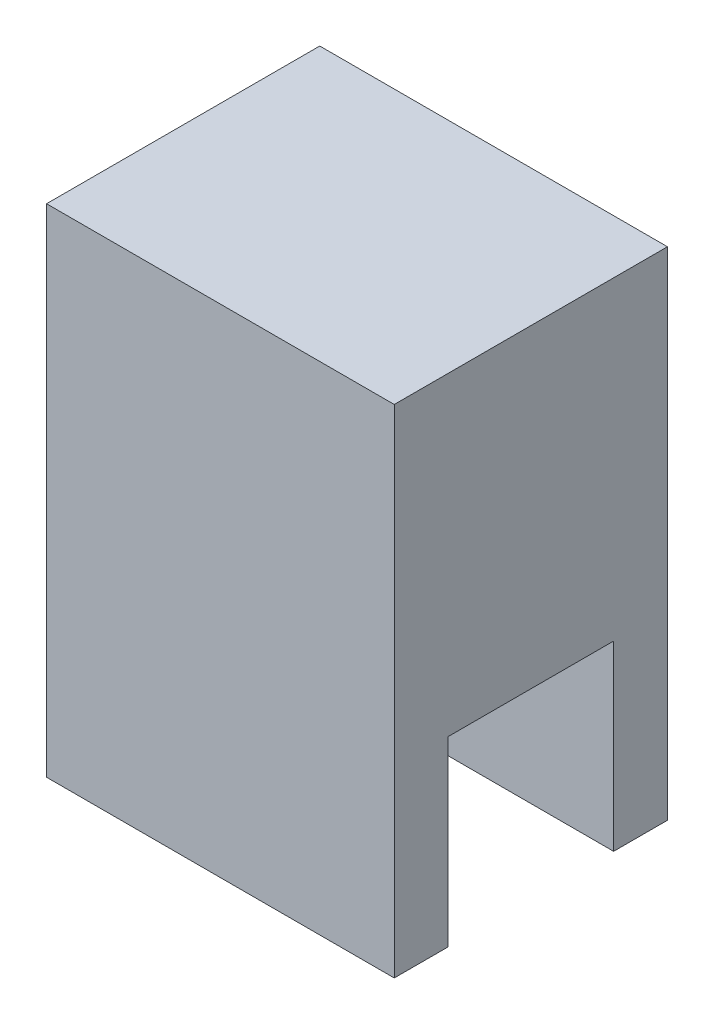
ISO-10303-21;
HEADER;
FILE_DESCRIPTION(('STEP AP214'),'2;1');
FILE_NAME('part.step','',(''),(''),'','','');
FILE_SCHEMA(('AUTOMOTIVE_DESIGN { 1 0 10303 214 1 1 1 1 }'));
ENDSEC;
DATA;
#1=APPLICATION_CONTEXT('core data for automotive mechanical design processes');
#2=APPLICATION_PROTOCOL_DEFINITION('international standard','automotive_design',2000,#1);
#3=PRODUCT_CONTEXT('',#1,'mechanical');
#4=PRODUCT('Part','Part','',(#3));
#5=PRODUCT_RELATED_PRODUCT_CATEGORY('part','',(#4));
#6=PRODUCT_DEFINITION_FORMATION('','',#4);
#7=PRODUCT_DEFINITION_CONTEXT('part definition',#1,'design');
#8=PRODUCT_DEFINITION('design','',#6,#7);
#9=PRODUCT_DEFINITION_SHAPE('','',#8);
#10=(LENGTH_UNIT() NAMED_UNIT(*) SI_UNIT(.MILLI.,.METRE.));
#11=(NAMED_UNIT(*) PLANE_ANGLE_UNIT() SI_UNIT($,.RADIAN.));
#12=(NAMED_UNIT(*) SI_UNIT($,.STERADIAN.) SOLID_ANGLE_UNIT());
#13=UNCERTAINTY_MEASURE_WITH_UNIT(LENGTH_MEASURE(1.E-05),#10,'distance_accuracy_value','');
#14=(GEOMETRIC_REPRESENTATION_CONTEXT(3) GLOBAL_UNCERTAINTY_ASSIGNED_CONTEXT((#13)) GLOBAL_UNIT_ASSIGNED_CONTEXT((#10,
#11,#12)) REPRESENTATION_CONTEXT('',''));
#15=CARTESIAN_POINT('',(0.,0.,0.));
#16=DIRECTION('',(0.,0.,1.));
#17=DIRECTION('',(1.,0.,0.));
#18=AXIS2_PLACEMENT_3D('',#15,#16,#17);
#19=CARTESIAN_POINT('',(0.,-30.,0.));
#20=DIRECTION('',(0.,1.,0.));
#21=DIRECTION('',(0.,0.,1.));
#22=AXIS2_PLACEMENT_3D('',#19,#20,#21);
#23=PLANE('',#22);
#24=DIRECTION('',(0.,0.,1.));
#25=VECTOR('',#24,1.);
#26=CARTESIAN_POINT('',(-21.,-30.,-16.5));
#27=LINE('',#26,#25);
#28=CARTESIAN_POINT('',(-21.,-30.,10.));
#29=VERTEX_POINT('',#28);
#30=CARTESIAN_POINT('',(-21.,-30.,16.5));
#31=VERTEX_POINT('',#30);
#32=EDGE_CURVE('E127',#29,#31,#27,.T.);
#33=ORIENTED_EDGE('',*,*,#32,.F.);
#34=DIRECTION('',(1.,0.,0.));
#35=VECTOR('',#34,1.);
#36=CARTESIAN_POINT('',(-21.,-30.,10.));
#37=LINE('',#36,#35);
#38=CARTESIAN_POINT('',(21.,-30.,10.));
#39=VERTEX_POINT('',#38);
#40=EDGE_CURVE('E114',#29,#39,#37,.T.);
#41=ORIENTED_EDGE('',*,*,#40,.T.);
#42=DIRECTION('',(0.,0.,-1.));
#43=VECTOR('',#42,1.);
#44=CARTESIAN_POINT('',(21.,-30.,-16.5));
#45=LINE('',#44,#43);
#46=CARTESIAN_POINT('',(21.,-30.,16.5));
#47=VERTEX_POINT('',#46);
#48=EDGE_CURVE('E126',#47,#39,#45,.T.);
#49=ORIENTED_EDGE('',*,*,#48,.F.);
#50=DIRECTION('',(1.,0.,0.));
#51=VECTOR('',#50,1.);
#52=CARTESIAN_POINT('',(-21.,-30.,16.5));
#53=LINE('',#52,#51);
#54=EDGE_CURVE('E82',#31,#47,#53,.T.);
#55=ORIENTED_EDGE('',*,*,#54,.F.);
#56=EDGE_LOOP('',(#33,#41,#49,#55));
#57=FACE_BOUND('',#56,.T.);
#58=ADVANCED_FACE('F37',(#57),#23,.F.);
#59=CARTESIAN_POINT('',(21.,30.,-16.5));
#60=DIRECTION('',(-1.,0.,0.));
#61=DIRECTION('',(0.,0.,1.));
#62=AXIS2_PLACEMENT_3D('',#59,#60,#61);
#63=PLANE('',#62);
#64=ORIENTED_EDGE('',*,*,#48,.T.);
#65=DIRECTION('',(0.,-1.,0.));
#66=VECTOR('',#65,1.);
#67=CARTESIAN_POINT('',(21.,-30.,10.));
#68=LINE('',#67,#66);
#69=CARTESIAN_POINT('',(21.,-8.,10.));
#70=VERTEX_POINT('',#69);
#71=EDGE_CURVE('E110',#70,#39,#68,.T.);
#72=ORIENTED_EDGE('',*,*,#71,.F.);
#73=DIRECTION('',(0.,0.,1.));
#74=VECTOR('',#73,1.);
#75=CARTESIAN_POINT('',(21.,-8.,10.));
#76=LINE('',#75,#74);
#77=CARTESIAN_POINT('',(21.,-8.,-10.));
#78=VERTEX_POINT('',#77);
#79=EDGE_CURVE('E202',#78,#70,#76,.T.);
#80=ORIENTED_EDGE('',*,*,#79,.F.);
#81=DIRECTION('',(0.,1.,0.));
#82=VECTOR('',#81,1.);
#83=CARTESIAN_POINT('',(21.,-30.,-10.));
#84=LINE('',#83,#82);
#85=CARTESIAN_POINT('',(21.,-30.,-10.));
#86=VERTEX_POINT('',#85);
#87=EDGE_CURVE('E121',#86,#78,#84,.T.);
#88=ORIENTED_EDGE('',*,*,#87,.F.);
#89=CARTESIAN_POINT('',(21.,-30.,-16.5));
#90=VERTEX_POINT('',#89);
#91=EDGE_CURVE('E134',#86,#90,#45,.T.);
#92=ORIENTED_EDGE('',*,*,#91,.T.);
#93=DIRECTION('',(0.,-1.,0.));
#94=VECTOR('',#93,1.);
#95=CARTESIAN_POINT('',(21.,30.,-16.5));
#96=LINE('',#95,#94);
#97=CARTESIAN_POINT('',(21.,30.,-16.5));
#98=VERTEX_POINT('',#97);
#99=EDGE_CURVE('E11',#98,#90,#96,.T.);
#100=ORIENTED_EDGE('',*,*,#99,.F.);
#101=DIRECTION('',(0.,0.,-1.));
#102=VECTOR('',#101,1.);
#103=CARTESIAN_POINT('',(21.,30.,-16.5));
#104=LINE('',#103,#102);
#105=CARTESIAN_POINT('',(21.,30.,16.5));
#106=VERTEX_POINT('',#105);
#107=EDGE_CURVE('E144',#106,#98,#104,.T.);
#108=ORIENTED_EDGE('',*,*,#107,.F.);
#109=DIRECTION('',(0.,-1.,0.));
#110=VECTOR('',#109,1.);
#111=CARTESIAN_POINT('',(21.,30.,16.5));
#112=LINE('',#111,#110);
#113=EDGE_CURVE('E132',#106,#47,#112,.T.);
#114=ORIENTED_EDGE('',*,*,#113,.T.);
#115=EDGE_LOOP('',(#64,#72,#80,#88,#92,#100,#108,#114));
#116=FACE_BOUND('',#115,.T.);
#117=ADVANCED_FACE('F39',(#116),#63,.F.);
#118=CARTESIAN_POINT('',(-21.,30.,-16.5));
#119=DIRECTION('',(0.,0.,1.));
#120=DIRECTION('',(1.,0.,0.));
#121=AXIS2_PLACEMENT_3D('',#118,#119,#120);
#122=PLANE('',#121);
#123=DIRECTION('',(-1.,0.,0.));
#124=VECTOR('',#123,1.);
#125=CARTESIAN_POINT('',(-21.,-30.,-16.5));
#126=LINE('',#125,#124);
#127=CARTESIAN_POINT('',(-21.,-30.,-16.5));
#128=VERTEX_POINT('',#127);
#129=EDGE_CURVE('E133',#90,#128,#126,.T.);
#130=ORIENTED_EDGE('',*,*,#129,.T.);
#131=DIRECTION('',(0.,-1.,0.));
#132=VECTOR('',#131,1.);
#133=CARTESIAN_POINT('',(-21.,30.,-16.5));
#134=LINE('',#133,#132);
#135=CARTESIAN_POINT('',(-21.,30.,-16.5));
#136=VERTEX_POINT('',#135);
#137=EDGE_CURVE('E45',#136,#128,#134,.T.);
#138=ORIENTED_EDGE('',*,*,#137,.F.);
#139=DIRECTION('',(-1.,0.,0.));
#140=VECTOR('',#139,1.);
#141=CARTESIAN_POINT('',(-21.,30.,-16.5));
#142=LINE('',#141,#140);
#143=EDGE_CURVE('E89',#98,#136,#142,.T.);
#144=ORIENTED_EDGE('',*,*,#143,.F.);
#145=ORIENTED_EDGE('',*,*,#99,.T.);
#146=EDGE_LOOP('',(#130,#138,#144,#145));
#147=FACE_BOUND('',#146,.T.);
#148=ADVANCED_FACE('F170',(#147),#122,.F.);
#149=CARTESIAN_POINT('',(-21.,30.,-16.5));
#150=DIRECTION('',(1.,0.,0.));
#151=DIRECTION('',(0.,0.,-1.));
#152=AXIS2_PLACEMENT_3D('',#149,#150,#151);
#153=PLANE('',#152);
#154=DIRECTION('',(0.,0.,1.));
#155=VECTOR('',#154,1.);
#156=CARTESIAN_POINT('',(-21.,-8.,10.));
#157=LINE('',#156,#155);
#158=CARTESIAN_POINT('',(-21.,-8.,-10.));
#159=VERTEX_POINT('',#158);
#160=CARTESIAN_POINT('',(-21.,-8.,10.));
#161=VERTEX_POINT('',#160);
#162=EDGE_CURVE('E129',#159,#161,#157,.T.);
#163=ORIENTED_EDGE('',*,*,#162,.T.);
#164=DIRECTION('',(0.,-1.,0.));
#165=VECTOR('',#164,1.);
#166=CARTESIAN_POINT('',(-21.,-30.,10.));
#167=LINE('',#166,#165);
#168=EDGE_CURVE('E203',#161,#29,#167,.T.);
#169=ORIENTED_EDGE('',*,*,#168,.T.);
#170=ORIENTED_EDGE('',*,*,#32,.T.);
#171=DIRECTION('',(0.,-1.,0.));
#172=VECTOR('',#171,1.);
#173=CARTESIAN_POINT('',(-21.,30.,16.5));
#174=LINE('',#173,#172);
#175=CARTESIAN_POINT('',(-21.,30.,16.5));
#176=VERTEX_POINT('',#175);
#177=EDGE_CURVE('E146',#176,#31,#174,.T.);
#178=ORIENTED_EDGE('',*,*,#177,.F.);
#179=DIRECTION('',(0.,0.,1.));
#180=VECTOR('',#179,1.);
#181=CARTESIAN_POINT('',(-21.,30.,-16.5));
#182=LINE('',#181,#180);
#183=EDGE_CURVE('E154',#136,#176,#182,.T.);
#184=ORIENTED_EDGE('',*,*,#183,.F.);
#185=ORIENTED_EDGE('',*,*,#137,.T.);
#186=CARTESIAN_POINT('',(-21.,-30.,-10.));
#187=VERTEX_POINT('',#186);
#188=EDGE_CURVE('E140',#128,#187,#27,.T.);
#189=ORIENTED_EDGE('',*,*,#188,.T.);
#190=DIRECTION('',(0.,1.,0.));
#191=VECTOR('',#190,1.);
#192=CARTESIAN_POINT('',(-21.,-30.,-10.));
#193=LINE('',#192,#191);
#194=EDGE_CURVE('E52',#187,#159,#193,.T.);
#195=ORIENTED_EDGE('',*,*,#194,.T.);
#196=EDGE_LOOP('',(#163,#169,#170,#178,#184,#185,#189,#195));
#197=FACE_BOUND('',#196,.T.);
#198=ADVANCED_FACE('F152',(#197),#153,.F.);
#199=CARTESIAN_POINT('',(-21.,30.,16.5));
#200=DIRECTION('',(0.,0.,-1.));
#201=DIRECTION('',(-1.,0.,0.));
#202=AXIS2_PLACEMENT_3D('',#199,#200,#201);
#203=PLANE('',#202);
#204=ORIENTED_EDGE('',*,*,#54,.T.);
#205=ORIENTED_EDGE('',*,*,#113,.F.);
#206=DIRECTION('',(1.,0.,0.));
#207=VECTOR('',#206,1.);
#208=CARTESIAN_POINT('',(-21.,30.,16.5));
#209=LINE('',#208,#207);
#210=EDGE_CURVE('E61',#176,#106,#209,.T.);
#211=ORIENTED_EDGE('',*,*,#210,.F.);
#212=ORIENTED_EDGE('',*,*,#177,.T.);
#213=EDGE_LOOP('',(#204,#205,#211,#212));
#214=FACE_BOUND('',#213,.T.);
#215=ADVANCED_FACE('F168',(#214),#203,.F.);
#216=CARTESIAN_POINT('',(0.,30.,0.));
#217=DIRECTION('',(0.,1.,0.));
#218=DIRECTION('',(0.,0.,1.));
#219=AXIS2_PLACEMENT_3D('',#216,#217,#218);
#220=PLANE('',#219);
#221=ORIENTED_EDGE('',*,*,#107,.T.);
#222=ORIENTED_EDGE('',*,*,#143,.T.);
#223=ORIENTED_EDGE('',*,*,#183,.T.);
#224=ORIENTED_EDGE('',*,*,#210,.T.);
#225=EDGE_LOOP('',(#221,#222,#223,#224));
#226=FACE_BOUND('',#225,.T.);
#227=ADVANCED_FACE('F167',(#226),#220,.T.);
#228=ORIENTED_EDGE('',*,*,#91,.F.);
#229=DIRECTION('',(1.,0.,0.));
#230=VECTOR('',#229,1.);
#231=CARTESIAN_POINT('',(-21.,-30.,-10.));
#232=LINE('',#231,#230);
#233=EDGE_CURVE('E128',#187,#86,#232,.T.);
#234=ORIENTED_EDGE('',*,*,#233,.F.);
#235=ORIENTED_EDGE('',*,*,#188,.F.);
#236=ORIENTED_EDGE('',*,*,#129,.F.);
#237=EDGE_LOOP('',(#228,#234,#235,#236));
#238=FACE_BOUND('',#237,.T.);
#239=ADVANCED_FACE('F158',(#238),#23,.F.);
#240=CARTESIAN_POINT('',(-21.,-30.,10.));
#241=DIRECTION('',(0.,0.,1.));
#242=DIRECTION('',(1.,0.,0.));
#243=AXIS2_PLACEMENT_3D('',#240,#241,#242);
#244=PLANE('',#243);
#245=ORIENTED_EDGE('',*,*,#40,.F.);
#246=ORIENTED_EDGE('',*,*,#168,.F.);
#247=DIRECTION('',(1.,0.,0.));
#248=VECTOR('',#247,1.);
#249=CARTESIAN_POINT('',(-21.,-8.,10.));
#250=LINE('',#249,#248);
#251=EDGE_CURVE('E116',#161,#70,#250,.T.);
#252=ORIENTED_EDGE('',*,*,#251,.T.);
#253=ORIENTED_EDGE('',*,*,#71,.T.);
#254=EDGE_LOOP('',(#245,#246,#252,#253));
#255=FACE_BOUND('',#254,.T.);
#256=ADVANCED_FACE('F112',(#255),#244,.F.);
#257=CARTESIAN_POINT('',(-21.,-8.,10.));
#258=DIRECTION('',(0.,1.,0.));
#259=DIRECTION('',(0.,0.,1.));
#260=AXIS2_PLACEMENT_3D('',#257,#258,#259);
#261=PLANE('',#260);
#262=ORIENTED_EDGE('',*,*,#251,.F.);
#263=ORIENTED_EDGE('',*,*,#162,.F.);
#264=DIRECTION('',(1.,0.,0.));
#265=VECTOR('',#264,1.);
#266=CARTESIAN_POINT('',(-21.,-8.,-10.));
#267=LINE('',#266,#265);
#268=EDGE_CURVE('E161',#159,#78,#267,.T.);
#269=ORIENTED_EDGE('',*,*,#268,.T.);
#270=ORIENTED_EDGE('',*,*,#79,.T.);
#271=EDGE_LOOP('',(#262,#263,#269,#270));
#272=FACE_BOUND('',#271,.T.);
#273=ADVANCED_FACE('F188',(#272),#261,.F.);
#274=CARTESIAN_POINT('',(-21.,-30.,-10.));
#275=DIRECTION('',(0.,0.,-1.));
#276=DIRECTION('',(-1.,0.,0.));
#277=AXIS2_PLACEMENT_3D('',#274,#275,#276);
#278=PLANE('',#277);
#279=ORIENTED_EDGE('',*,*,#268,.F.);
#280=ORIENTED_EDGE('',*,*,#194,.F.);
#281=ORIENTED_EDGE('',*,*,#233,.T.);
#282=ORIENTED_EDGE('',*,*,#87,.T.);
#283=EDGE_LOOP('',(#279,#280,#281,#282));
#284=FACE_BOUND('',#283,.T.);
#285=ADVANCED_FACE('F194',(#284),#278,.F.);
#286=CLOSED_SHELL('',(#58,#117,#148,#198,#215,#227,#239,#256,#273,#285));
#287=MANIFOLD_SOLID_BREP('B2',#286);
#288=ADVANCED_BREP_SHAPE_REPRESENTATION('',(#18,#287),#14);
#289=SHAPE_DEFINITION_REPRESENTATION(#9,#288);
ENDSEC;
END-ISO-10303-21;
